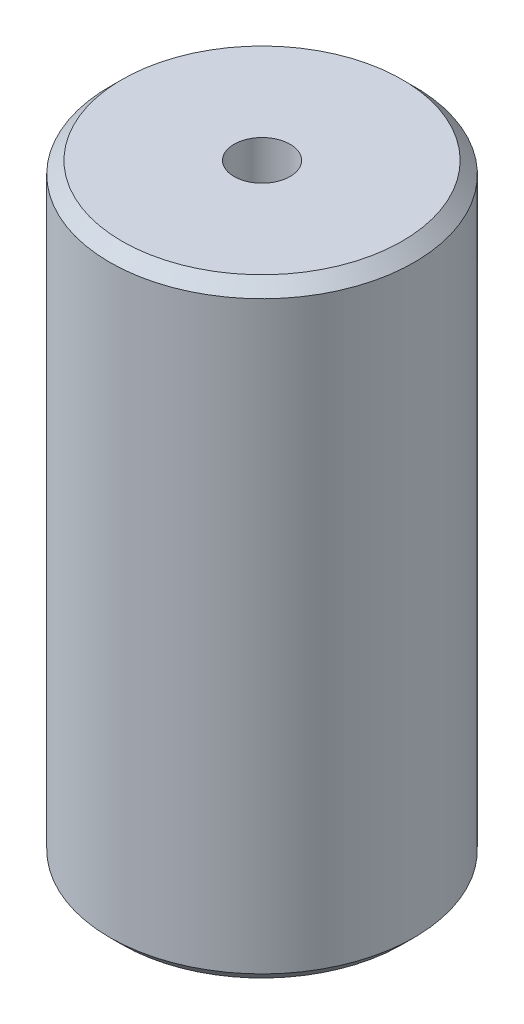
ISO-10303-21;
HEADER;
FILE_DESCRIPTION(('STEP AP214'),'2;1');
FILE_NAME('part.step','',(''),(''),'','','');
FILE_SCHEMA(('AUTOMOTIVE_DESIGN { 1 0 10303 214 1 1 1 1 }'));
ENDSEC;
DATA;
#1=APPLICATION_CONTEXT('core data for automotive mechanical design processes');
#2=APPLICATION_PROTOCOL_DEFINITION('international standard','automotive_design',2000,#1);
#3=PRODUCT_CONTEXT('',#1,'mechanical');
#4=PRODUCT('Part','Part','',(#3));
#5=PRODUCT_RELATED_PRODUCT_CATEGORY('part','',(#4));
#6=PRODUCT_DEFINITION_FORMATION('','',#4);
#7=PRODUCT_DEFINITION_CONTEXT('part definition',#1,'design');
#8=PRODUCT_DEFINITION('design','',#6,#7);
#9=PRODUCT_DEFINITION_SHAPE('','',#8);
#10=(LENGTH_UNIT() NAMED_UNIT(*) SI_UNIT(.MILLI.,.METRE.));
#11=(NAMED_UNIT(*) PLANE_ANGLE_UNIT() SI_UNIT($,.RADIAN.));
#12=(NAMED_UNIT(*) SI_UNIT($,.STERADIAN.) SOLID_ANGLE_UNIT());
#13=UNCERTAINTY_MEASURE_WITH_UNIT(LENGTH_MEASURE(1.E-05),#10,'distance_accuracy_value','');
#14=(GEOMETRIC_REPRESENTATION_CONTEXT(3) GLOBAL_UNCERTAINTY_ASSIGNED_CONTEXT((#13)) GLOBAL_UNIT_ASSIGNED_CONTEXT((#10,
#11,#12)) REPRESENTATION_CONTEXT('',''));
#15=CARTESIAN_POINT('',(0.,0.,0.));
#16=DIRECTION('',(0.,0.,1.));
#17=DIRECTION('',(1.,0.,0.));
#18=AXIS2_PLACEMENT_3D('',#15,#16,#17);
#19=CARTESIAN_POINT('',(0.,9.,0.));
#20=DIRECTION('',(0.,-1.,0.));
#21=DIRECTION('',(0.,0.,-1.));
#22=AXIS2_PLACEMENT_3D('',#19,#20,#21);
#23=CYLINDRICAL_SURFACE('',#22,6.25);
#24=CARTESIAN_POINT('',(0.,24.5,0.));
#25=DIRECTION('',(0.,1.,0.));
#26=DIRECTION('',(0.,0.,1.));
#27=AXIS2_PLACEMENT_3D('',#24,#25,#26);
#28=CIRCLE('',#27,6.25);
#29=CARTESIAN_POINT('',(0.,24.5,6.25));
#30=VERTEX_POINT('',#29);
#31=EDGE_CURVE('E47',#30,#30,#28,.F.);
#32=ORIENTED_EDGE('',*,*,#31,.T.);
#33=EDGE_LOOP('',(#32));
#34=FACE_BOUND('',#33,.T.);
#35=CARTESIAN_POINT('',(0.,0.500000000000002,0.));
#36=DIRECTION('',(0.,1.,0.));
#37=DIRECTION('',(0.,0.,1.));
#38=AXIS2_PLACEMENT_3D('',#35,#36,#37);
#39=CIRCLE('',#38,6.25);
#40=CARTESIAN_POINT('',(0.,0.500000000000002,6.25));
#41=VERTEX_POINT('',#40);
#42=EDGE_CURVE('E51',#41,#41,#39,.T.);
#43=ORIENTED_EDGE('',*,*,#42,.T.);
#44=EDGE_LOOP('',(#43));
#45=FACE_BOUND('',#44,.T.);
#46=ADVANCED_FACE('F39',(#34,#45),#23,.T.);
#47=CARTESIAN_POINT('',(0.,0.,0.));
#48=DIRECTION('',(0.,1.,0.));
#49=DIRECTION('',(0.,0.,1.));
#50=AXIS2_PLACEMENT_3D('',#47,#48,#49);
#51=PLANE('',#50);
#52=CARTESIAN_POINT('',(0.,0.,0.));
#53=DIRECTION('',(0.,1.,0.));
#54=DIRECTION('',(0.,0.,1.));
#55=AXIS2_PLACEMENT_3D('',#52,#53,#54);
#56=CIRCLE('',#55,5.75);
#57=CARTESIAN_POINT('',(0.,0.,5.75));
#58=VERTEX_POINT('',#57);
#59=EDGE_CURVE('E10',#58,#58,#56,.F.);
#60=ORIENTED_EDGE('',*,*,#59,.T.);
#61=EDGE_LOOP('',(#60));
#62=FACE_BOUND('',#61,.T.);
#63=CARTESIAN_POINT('',(0.,0.,0.));
#64=DIRECTION('',(0.,-1.,0.));
#65=DIRECTION('',(0.,0.,-1.));
#66=AXIS2_PLACEMENT_3D('',#63,#64,#65);
#67=CIRCLE('',#66,2.);
#68=CARTESIAN_POINT('',(0.,0.,-2.));
#69=VERTEX_POINT('',#68);
#70=EDGE_CURVE('E61',#69,#69,#67,.T.);
#71=ORIENTED_EDGE('',*,*,#70,.F.);
#72=EDGE_LOOP('',(#71));
#73=FACE_BOUND('',#72,.T.);
#74=ADVANCED_FACE('F86',(#62,#73),#51,.F.);
#75=CARTESIAN_POINT('',(0.,25.,0.));
#76=DIRECTION('',(0.,1.,0.));
#77=DIRECTION('',(0.,0.,1.));
#78=AXIS2_PLACEMENT_3D('',#75,#76,#77);
#79=PLANE('',#78);
#80=CARTESIAN_POINT('',(0.,25.,0.));
#81=DIRECTION('',(0.,1.,0.));
#82=DIRECTION('',(0.,0.,1.));
#83=AXIS2_PLACEMENT_3D('',#80,#81,#82);
#84=CIRCLE('',#83,5.75000000000001);
#85=CARTESIAN_POINT('',(0.,25.,5.75000000000001));
#86=VERTEX_POINT('',#85);
#87=EDGE_CURVE('E55',#86,#86,#84,.T.);
#88=ORIENTED_EDGE('',*,*,#87,.T.);
#89=EDGE_LOOP('',(#88));
#90=FACE_BOUND('',#89,.T.);
#91=CARTESIAN_POINT('',(0.,25.,0.));
#92=DIRECTION('',(0.,1.,0.));
#93=DIRECTION('',(0.,0.,1.));
#94=AXIS2_PLACEMENT_3D('',#91,#92,#93);
#95=CIRCLE('',#94,1.15);
#96=CARTESIAN_POINT('',(0.,25.,1.15));
#97=VERTEX_POINT('',#96);
#98=EDGE_CURVE('E67',#97,#97,#95,.T.);
#99=ORIENTED_EDGE('',*,*,#98,.F.);
#100=EDGE_LOOP('',(#99));
#101=FACE_BOUND('',#100,.T.);
#102=ADVANCED_FACE('F83',(#90,#101),#79,.T.);
#103=CARTESIAN_POINT('',(0.,12.5,0.));
#104=DIRECTION('',(0.,-1.,0.));
#105=DIRECTION('',(0.,0.,-1.));
#106=AXIS2_PLACEMENT_3D('',#103,#104,#105);
#107=CYLINDRICAL_SURFACE('',#106,2.);
#108=CARTESIAN_POINT('',(0.,12.5,0.));
#109=DIRECTION('',(0.,-1.,0.));
#110=DIRECTION('',(0.,0.,-1.));
#111=AXIS2_PLACEMENT_3D('',#108,#109,#110);
#112=CIRCLE('',#111,2.);
#113=CARTESIAN_POINT('',(0.,12.5,-2.));
#114=VERTEX_POINT('',#113);
#115=EDGE_CURVE('E60',#114,#114,#112,.T.);
#116=ORIENTED_EDGE('',*,*,#115,.F.);
#117=EDGE_LOOP('',(#116));
#118=FACE_BOUND('',#117,.T.);
#119=ORIENTED_EDGE('',*,*,#70,.T.);
#120=EDGE_LOOP('',(#119));
#121=FACE_BOUND('',#120,.T.);
#122=ADVANCED_FACE('F85',(#118,#121),#107,.F.);
#123=CARTESIAN_POINT('',(0.,12.5,0.));
#124=DIRECTION('',(0.,-1.,0.));
#125=DIRECTION('',(0.,0.,-1.));
#126=AXIS2_PLACEMENT_3D('',#123,#124,#125);
#127=PLANE('',#126);
#128=CARTESIAN_POINT('',(0.,12.5,0.));
#129=DIRECTION('',(0.,1.,0.));
#130=DIRECTION('',(0.,0.,1.));
#131=AXIS2_PLACEMENT_3D('',#128,#129,#130);
#132=CIRCLE('',#131,1.15);
#133=CARTESIAN_POINT('',(0.,12.5,1.15));
#134=VERTEX_POINT('',#133);
#135=EDGE_CURVE('E64',#134,#134,#132,.T.);
#136=ORIENTED_EDGE('',*,*,#135,.T.);
#137=EDGE_LOOP('',(#136));
#138=FACE_BOUND('',#137,.T.);
#139=ORIENTED_EDGE('',*,*,#115,.T.);
#140=EDGE_LOOP('',(#139));
#141=FACE_BOUND('',#140,.T.);
#142=ADVANCED_FACE('F73',(#138,#141),#127,.T.);
#143=CARTESIAN_POINT('',(0.,12.5,0.));
#144=DIRECTION('',(0.,1.,0.));
#145=DIRECTION('',(0.,0.,1.));
#146=AXIS2_PLACEMENT_3D('',#143,#144,#145);
#147=CYLINDRICAL_SURFACE('',#146,1.15);
#148=ORIENTED_EDGE('',*,*,#135,.F.);
#149=EDGE_LOOP('',(#148));
#150=FACE_BOUND('',#149,.T.);
#151=ORIENTED_EDGE('',*,*,#98,.T.);
#152=EDGE_LOOP('',(#151));
#153=FACE_BOUND('',#152,.T.);
#154=ADVANCED_FACE('F76',(#150,#153),#147,.F.);
#155=CARTESIAN_POINT('',(0.,25.,0.));
#156=DIRECTION('',(0.,-1.,0.));
#157=DIRECTION('',(0.,0.,-1.));
#158=AXIS2_PLACEMENT_3D('',#155,#156,#157);
#159=CONICAL_SURFACE('',#158,5.75000000000001,0.785398163397443);
#160=ORIENTED_EDGE('',*,*,#31,.F.);
#161=EDGE_LOOP('',(#160));
#162=FACE_BOUND('',#161,.T.);
#163=ORIENTED_EDGE('',*,*,#87,.F.);
#164=EDGE_LOOP('',(#163));
#165=FACE_BOUND('',#164,.T.);
#166=ADVANCED_FACE('F79',(#162,#165),#159,.T.);
#167=CARTESIAN_POINT('',(0.,0.500000000000002,0.));
#168=DIRECTION('',(0.,1.,0.));
#169=DIRECTION('',(0.,0.,1.));
#170=AXIS2_PLACEMENT_3D('',#167,#168,#169);
#171=CONICAL_SURFACE('',#170,6.25,0.785398163397448);
#172=ORIENTED_EDGE('',*,*,#59,.F.);
#173=EDGE_LOOP('',(#172));
#174=FACE_BOUND('',#173,.T.);
#175=ORIENTED_EDGE('',*,*,#42,.F.);
#176=EDGE_LOOP('',(#175));
#177=FACE_BOUND('',#176,.T.);
#178=ADVANCED_FACE('F42',(#174,#177),#171,.T.);
#179=CLOSED_SHELL('',(#46,#74,#102,#122,#142,#154,#166,#178));
#180=MANIFOLD_SOLID_BREP('B2',#179);
#181=ADVANCED_BREP_SHAPE_REPRESENTATION('',(#18,#180),#14);
#182=SHAPE_DEFINITION_REPRESENTATION(#9,#181);
ENDSEC;
END-ISO-10303-21;
